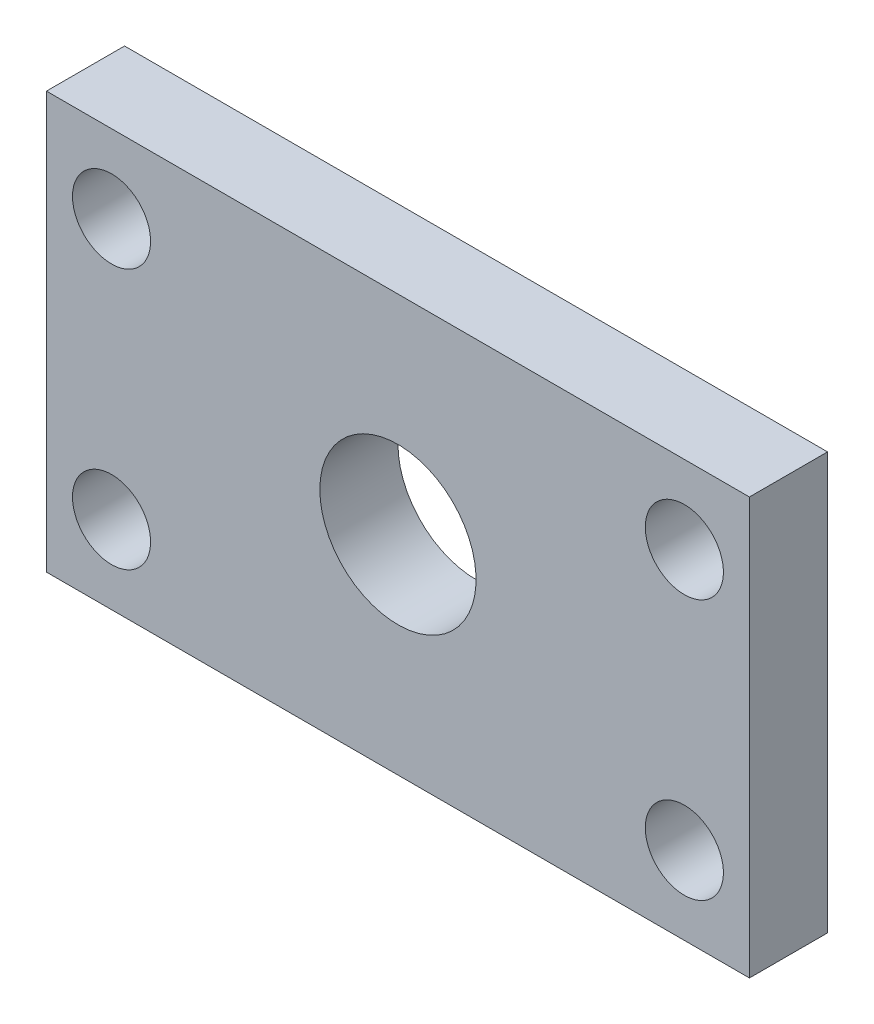
ISO-10303-21;
HEADER;
FILE_DESCRIPTION(('STEP AP214'),'2;1');
FILE_NAME('part.step','',(''),(''),'','','');
FILE_SCHEMA(('AUTOMOTIVE_DESIGN { 1 0 10303 214 1 1 1 1 }'));
ENDSEC;
DATA;
#1=APPLICATION_CONTEXT('core data for automotive mechanical design processes');
#2=APPLICATION_PROTOCOL_DEFINITION('international standard','automotive_design',2000,#1);
#3=PRODUCT_CONTEXT('',#1,'mechanical');
#4=PRODUCT('Part','Part','',(#3));
#5=PRODUCT_RELATED_PRODUCT_CATEGORY('part','',(#4));
#6=PRODUCT_DEFINITION_FORMATION('','',#4);
#7=PRODUCT_DEFINITION_CONTEXT('part definition',#1,'design');
#8=PRODUCT_DEFINITION('design','',#6,#7);
#9=PRODUCT_DEFINITION_SHAPE('','',#8);
#10=(LENGTH_UNIT() NAMED_UNIT(*) SI_UNIT(.MILLI.,.METRE.));
#11=(NAMED_UNIT(*) PLANE_ANGLE_UNIT() SI_UNIT($,.RADIAN.));
#12=(NAMED_UNIT(*) SI_UNIT($,.STERADIAN.) SOLID_ANGLE_UNIT());
#13=UNCERTAINTY_MEASURE_WITH_UNIT(LENGTH_MEASURE(1.E-05),#10,'distance_accuracy_value','');
#14=(GEOMETRIC_REPRESENTATION_CONTEXT(3) GLOBAL_UNCERTAINTY_ASSIGNED_CONTEXT((#13)) GLOBAL_UNIT_ASSIGNED_CONTEXT((#10,
#11,#12)) REPRESENTATION_CONTEXT('',''));
#15=CARTESIAN_POINT('',(0.,0.,0.));
#16=DIRECTION('',(0.,0.,1.));
#17=DIRECTION('',(1.,0.,0.));
#18=AXIS2_PLACEMENT_3D('',#15,#16,#17);
#19=CARTESIAN_POINT('',(0.,0.,0.));
#20=DIRECTION('',(0.,0.,-1.));
#21=DIRECTION('',(-1.,0.,0.));
#22=AXIS2_PLACEMENT_3D('',#19,#20,#21);
#23=PLANE('',#22);
#24=CARTESIAN_POINT('',(-11.,-5.,0.));
#25=DIRECTION('',(0.,0.,-1.));
#26=DIRECTION('',(-1.,0.,0.));
#27=AXIS2_PLACEMENT_3D('',#24,#25,#26);
#28=CIRCLE('',#27,1.5);
#29=CARTESIAN_POINT('',(-12.5,-5.,0.));
#30=VERTEX_POINT('',#29);
#31=EDGE_CURVE('E91',#30,#30,#28,.F.);
#32=ORIENTED_EDGE('',*,*,#31,.T.);
#33=EDGE_LOOP('',(#32));
#34=FACE_BOUND('',#33,.T.);
#35=CARTESIAN_POINT('',(11.,5.,0.));
#36=DIRECTION('',(0.,0.,-1.));
#37=DIRECTION('',(-1.,0.,0.));
#38=AXIS2_PLACEMENT_3D('',#35,#36,#37);
#39=CIRCLE('',#38,1.5);
#40=CARTESIAN_POINT('',(9.50000000000001,5.,0.));
#41=VERTEX_POINT('',#40);
#42=EDGE_CURVE('E97',#41,#41,#39,.F.);
#43=ORIENTED_EDGE('',*,*,#42,.T.);
#44=EDGE_LOOP('',(#43));
#45=FACE_BOUND('',#44,.T.);
#46=CARTESIAN_POINT('',(0.,0.,0.));
#47=DIRECTION('',(0.,0.,-1.));
#48=DIRECTION('',(-1.,0.,0.));
#49=AXIS2_PLACEMENT_3D('',#46,#47,#48);
#50=CIRCLE('',#49,3.);
#51=CARTESIAN_POINT('',(-3.,0.,0.));
#52=VERTEX_POINT('',#51);
#53=EDGE_CURVE('E18',#52,#52,#50,.F.);
#54=ORIENTED_EDGE('',*,*,#53,.T.);
#55=EDGE_LOOP('',(#54));
#56=FACE_BOUND('',#55,.T.);
#57=DIRECTION('',(0.,1.,0.));
#58=VECTOR('',#57,1.);
#59=CARTESIAN_POINT('',(-13.5,-8.,0.));
#60=LINE('',#59,#58);
#61=CARTESIAN_POINT('',(-13.5,-8.,0.));
#62=VERTEX_POINT('',#61);
#63=CARTESIAN_POINT('',(-13.5,8.,0.));
#64=VERTEX_POINT('',#63);
#65=EDGE_CURVE('E54',#62,#64,#60,.T.);
#66=ORIENTED_EDGE('',*,*,#65,.T.);
#67=DIRECTION('',(1.,0.,0.));
#68=VECTOR('',#67,1.);
#69=CARTESIAN_POINT('',(-13.5,8.,0.));
#70=LINE('',#69,#68);
#71=CARTESIAN_POINT('',(13.5,8.,0.));
#72=VERTEX_POINT('',#71);
#73=EDGE_CURVE('E112',#64,#72,#70,.T.);
#74=ORIENTED_EDGE('',*,*,#73,.T.);
#75=DIRECTION('',(0.,1.,0.));
#76=VECTOR('',#75,1.);
#77=CARTESIAN_POINT('',(13.5,-8.,0.));
#78=LINE('',#77,#76);
#79=CARTESIAN_POINT('',(13.5,-8.,0.));
#80=VERTEX_POINT('',#79);
#81=EDGE_CURVE('E59',#72,#80,#78,.F.);
#82=ORIENTED_EDGE('',*,*,#81,.T.);
#83=DIRECTION('',(1.,0.,0.));
#84=VECTOR('',#83,1.);
#85=CARTESIAN_POINT('',(-13.5,-8.,0.));
#86=LINE('',#85,#84);
#87=EDGE_CURVE('E57',#80,#62,#86,.F.);
#88=ORIENTED_EDGE('',*,*,#87,.T.);
#89=EDGE_LOOP('',(#66,#74,#82,#88));
#90=FACE_BOUND('',#89,.T.);
#91=CARTESIAN_POINT('',(-11.,5.,0.));
#92=DIRECTION('',(0.,0.,-1.));
#93=DIRECTION('',(-1.,0.,0.));
#94=AXIS2_PLACEMENT_3D('',#91,#92,#93);
#95=CIRCLE('',#94,1.5);
#96=CARTESIAN_POINT('',(-12.5,5.,0.));
#97=VERTEX_POINT('',#96);
#98=EDGE_CURVE('E99',#97,#97,#95,.F.);
#99=ORIENTED_EDGE('',*,*,#98,.T.);
#100=EDGE_LOOP('',(#99));
#101=FACE_BOUND('',#100,.T.);
#102=CARTESIAN_POINT('',(11.,-5.,0.));
#103=DIRECTION('',(0.,0.,-1.));
#104=DIRECTION('',(-1.,0.,0.));
#105=AXIS2_PLACEMENT_3D('',#102,#103,#104);
#106=CIRCLE('',#105,1.5);
#107=CARTESIAN_POINT('',(9.50000000000001,-5.,0.));
#108=VERTEX_POINT('',#107);
#109=EDGE_CURVE('E94',#108,#108,#106,.F.);
#110=ORIENTED_EDGE('',*,*,#109,.T.);
#111=EDGE_LOOP('',(#110));
#112=FACE_BOUND('',#111,.T.);
#113=ADVANCED_FACE('F15',(#34,#45,#56,#90,#101,#112),#23,.T.);
#114=CARTESIAN_POINT('',(-13.5,-8.,3.));
#115=DIRECTION('',(0.,1.,0.));
#116=DIRECTION('',(0.,0.,1.));
#117=AXIS2_PLACEMENT_3D('',#114,#115,#116);
#118=PLANE('',#117);
#119=DIRECTION('',(0.,0.,1.));
#120=VECTOR('',#119,1.);
#121=CARTESIAN_POINT('',(13.5,-8.,3.));
#122=LINE('',#121,#120);
#123=CARTESIAN_POINT('',(13.5,-8.,3.));
#124=VERTEX_POINT('',#123);
#125=EDGE_CURVE('E106',#80,#124,#122,.T.);
#126=ORIENTED_EDGE('',*,*,#125,.T.);
#127=DIRECTION('',(-1.,0.,0.));
#128=VECTOR('',#127,1.);
#129=CARTESIAN_POINT('',(0.,-8.,3.));
#130=LINE('',#129,#128);
#131=CARTESIAN_POINT('',(-13.5,-8.,3.));
#132=VERTEX_POINT('',#131);
#133=EDGE_CURVE('E75',#124,#132,#130,.T.);
#134=ORIENTED_EDGE('',*,*,#133,.T.);
#135=DIRECTION('',(0.,0.,-1.));
#136=VECTOR('',#135,1.);
#137=CARTESIAN_POINT('',(-13.5,-8.,3.));
#138=LINE('',#137,#136);
#139=EDGE_CURVE('E64',#132,#62,#138,.T.);
#140=ORIENTED_EDGE('',*,*,#139,.T.);
#141=ORIENTED_EDGE('',*,*,#87,.F.);
#142=EDGE_LOOP('',(#126,#134,#140,#141));
#143=FACE_BOUND('',#142,.T.);
#144=ADVANCED_FACE('F74',(#143),#118,.F.);
#145=CARTESIAN_POINT('',(-13.5,-8.,3.));
#146=DIRECTION('',(1.,0.,0.));
#147=DIRECTION('',(0.,0.,-1.));
#148=AXIS2_PLACEMENT_3D('',#145,#146,#147);
#149=PLANE('',#148);
#150=ORIENTED_EDGE('',*,*,#139,.F.);
#151=DIRECTION('',(0.,1.,0.));
#152=VECTOR('',#151,1.);
#153=CARTESIAN_POINT('',(-13.5,0.,3.));
#154=LINE('',#153,#152);
#155=CARTESIAN_POINT('',(-13.5,8.,3.));
#156=VERTEX_POINT('',#155);
#157=EDGE_CURVE('E120',#132,#156,#154,.T.);
#158=ORIENTED_EDGE('',*,*,#157,.T.);
#159=DIRECTION('',(0.,0.,-1.));
#160=VECTOR('',#159,1.);
#161=CARTESIAN_POINT('',(-13.5,8.,3.));
#162=LINE('',#161,#160);
#163=EDGE_CURVE('E71',#156,#64,#162,.T.);
#164=ORIENTED_EDGE('',*,*,#163,.T.);
#165=ORIENTED_EDGE('',*,*,#65,.F.);
#166=EDGE_LOOP('',(#150,#158,#164,#165));
#167=FACE_BOUND('',#166,.T.);
#168=ADVANCED_FACE('F68',(#167),#149,.F.);
#169=CARTESIAN_POINT('',(-13.5,8.,3.));
#170=DIRECTION('',(0.,-1.,0.));
#171=DIRECTION('',(0.,0.,-1.));
#172=AXIS2_PLACEMENT_3D('',#169,#170,#171);
#173=PLANE('',#172);
#174=ORIENTED_EDGE('',*,*,#163,.F.);
#175=DIRECTION('',(-1.,0.,0.));
#176=VECTOR('',#175,1.);
#177=CARTESIAN_POINT('',(0.,8.,3.));
#178=LINE('',#177,#176);
#179=CARTESIAN_POINT('',(13.5,8.,3.));
#180=VERTEX_POINT('',#179);
#181=EDGE_CURVE('E118',#156,#180,#178,.F.);
#182=ORIENTED_EDGE('',*,*,#181,.T.);
#183=DIRECTION('',(0.,0.,1.));
#184=VECTOR('',#183,1.);
#185=CARTESIAN_POINT('',(13.5,8.,3.));
#186=LINE('',#185,#184);
#187=EDGE_CURVE('E33',#180,#72,#186,.F.);
#188=ORIENTED_EDGE('',*,*,#187,.T.);
#189=ORIENTED_EDGE('',*,*,#73,.F.);
#190=EDGE_LOOP('',(#174,#182,#188,#189));
#191=FACE_BOUND('',#190,.T.);
#192=ADVANCED_FACE('F116',(#191),#173,.F.);
#193=CARTESIAN_POINT('',(13.5,-8.,3.));
#194=DIRECTION('',(-1.,0.,0.));
#195=DIRECTION('',(0.,0.,1.));
#196=AXIS2_PLACEMENT_3D('',#193,#194,#195);
#197=PLANE('',#196);
#198=ORIENTED_EDGE('',*,*,#187,.F.);
#199=DIRECTION('',(0.,1.,0.));
#200=VECTOR('',#199,1.);
#201=CARTESIAN_POINT('',(13.5,0.,3.));
#202=LINE('',#201,#200);
#203=EDGE_CURVE('E90',#180,#124,#202,.F.);
#204=ORIENTED_EDGE('',*,*,#203,.T.);
#205=ORIENTED_EDGE('',*,*,#125,.F.);
#206=ORIENTED_EDGE('',*,*,#81,.F.);
#207=EDGE_LOOP('',(#198,#204,#205,#206));
#208=FACE_BOUND('',#207,.T.);
#209=ADVANCED_FACE('F114',(#208),#197,.F.);
#210=CARTESIAN_POINT('',(0.,0.,3.));
#211=DIRECTION('',(0.,0.,-1.));
#212=DIRECTION('',(-1.,0.,0.));
#213=AXIS2_PLACEMENT_3D('',#210,#211,#212);
#214=CYLINDRICAL_SURFACE('',#213,3.);
#215=ORIENTED_EDGE('',*,*,#53,.F.);
#216=EDGE_LOOP('',(#215));
#217=FACE_BOUND('',#216,.T.);
#218=CARTESIAN_POINT('',(0.,0.,3.));
#219=DIRECTION('',(0.,0.,-1.));
#220=DIRECTION('',(-1.,0.,0.));
#221=AXIS2_PLACEMENT_3D('',#218,#219,#220);
#222=CIRCLE('',#221,3.);
#223=CARTESIAN_POINT('',(-3.,0.,3.));
#224=VERTEX_POINT('',#223);
#225=EDGE_CURVE('E87',#224,#224,#222,.F.);
#226=ORIENTED_EDGE('',*,*,#225,.T.);
#227=EDGE_LOOP('',(#226));
#228=FACE_BOUND('',#227,.T.);
#229=ADVANCED_FACE('F148',(#217,#228),#214,.F.);
#230=CARTESIAN_POINT('',(-11.,5.,3.));
#231=DIRECTION('',(0.,0.,-1.));
#232=DIRECTION('',(-1.,0.,0.));
#233=AXIS2_PLACEMENT_3D('',#230,#231,#232);
#234=CYLINDRICAL_SURFACE('',#233,1.5);
#235=ORIENTED_EDGE('',*,*,#98,.F.);
#236=EDGE_LOOP('',(#235));
#237=FACE_BOUND('',#236,.T.);
#238=CARTESIAN_POINT('',(-11.,5.,3.));
#239=DIRECTION('',(0.,0.,-1.));
#240=DIRECTION('',(-1.,0.,0.));
#241=AXIS2_PLACEMENT_3D('',#238,#239,#240);
#242=CIRCLE('',#241,1.5);
#243=CARTESIAN_POINT('',(-12.5,5.,3.));
#244=VERTEX_POINT('',#243);
#245=EDGE_CURVE('E84',#244,#244,#242,.F.);
#246=ORIENTED_EDGE('',*,*,#245,.T.);
#247=EDGE_LOOP('',(#246));
#248=FACE_BOUND('',#247,.T.);
#249=ADVANCED_FACE('F144',(#237,#248),#234,.F.);
#250=CARTESIAN_POINT('',(11.,5.,3.));
#251=DIRECTION('',(0.,0.,-1.));
#252=DIRECTION('',(-1.,0.,0.));
#253=AXIS2_PLACEMENT_3D('',#250,#251,#252);
#254=CYLINDRICAL_SURFACE('',#253,1.5);
#255=ORIENTED_EDGE('',*,*,#42,.F.);
#256=EDGE_LOOP('',(#255));
#257=FACE_BOUND('',#256,.T.);
#258=CARTESIAN_POINT('',(11.,5.,3.));
#259=DIRECTION('',(0.,0.,-1.));
#260=DIRECTION('',(-1.,0.,0.));
#261=AXIS2_PLACEMENT_3D('',#258,#259,#260);
#262=CIRCLE('',#261,1.5);
#263=CARTESIAN_POINT('',(9.50000000000001,5.,3.));
#264=VERTEX_POINT('',#263);
#265=EDGE_CURVE('E81',#264,#264,#262,.F.);
#266=ORIENTED_EDGE('',*,*,#265,.T.);
#267=EDGE_LOOP('',(#266));
#268=FACE_BOUND('',#267,.T.);
#269=ADVANCED_FACE('F140',(#257,#268),#254,.F.);
#270=CARTESIAN_POINT('',(11.,-5.,3.));
#271=DIRECTION('',(0.,0.,-1.));
#272=DIRECTION('',(-1.,0.,0.));
#273=AXIS2_PLACEMENT_3D('',#270,#271,#272);
#274=CYLINDRICAL_SURFACE('',#273,1.5);
#275=ORIENTED_EDGE('',*,*,#109,.F.);
#276=EDGE_LOOP('',(#275));
#277=FACE_BOUND('',#276,.T.);
#278=CARTESIAN_POINT('',(11.,-5.,3.));
#279=DIRECTION('',(0.,0.,-1.));
#280=DIRECTION('',(-1.,0.,0.));
#281=AXIS2_PLACEMENT_3D('',#278,#279,#280);
#282=CIRCLE('',#281,1.5);
#283=CARTESIAN_POINT('',(9.50000000000001,-5.,3.));
#284=VERTEX_POINT('',#283);
#285=EDGE_CURVE('E24',#284,#284,#282,.F.);
#286=ORIENTED_EDGE('',*,*,#285,.T.);
#287=EDGE_LOOP('',(#286));
#288=FACE_BOUND('',#287,.T.);
#289=ADVANCED_FACE('F132',(#277,#288),#274,.F.);
#290=CARTESIAN_POINT('',(-11.,-5.,3.));
#291=DIRECTION('',(0.,0.,-1.));
#292=DIRECTION('',(-1.,0.,0.));
#293=AXIS2_PLACEMENT_3D('',#290,#291,#292);
#294=CYLINDRICAL_SURFACE('',#293,1.5);
#295=ORIENTED_EDGE('',*,*,#31,.F.);
#296=EDGE_LOOP('',(#295));
#297=FACE_BOUND('',#296,.T.);
#298=CARTESIAN_POINT('',(-11.,-5.,3.));
#299=DIRECTION('',(0.,0.,-1.));
#300=DIRECTION('',(-1.,0.,0.));
#301=AXIS2_PLACEMENT_3D('',#298,#299,#300);
#302=CIRCLE('',#301,1.5);
#303=CARTESIAN_POINT('',(-12.5,-5.,3.));
#304=VERTEX_POINT('',#303);
#305=EDGE_CURVE('E10',#304,#304,#302,.F.);
#306=ORIENTED_EDGE('',*,*,#305,.T.);
#307=EDGE_LOOP('',(#306));
#308=FACE_BOUND('',#307,.T.);
#309=ADVANCED_FACE('F125',(#297,#308),#294,.F.);
#310=CARTESIAN_POINT('',(0.,0.,3.));
#311=DIRECTION('',(0.,0.,-1.));
#312=DIRECTION('',(-1.,0.,0.));
#313=AXIS2_PLACEMENT_3D('',#310,#311,#312);
#314=PLANE('',#313);
#315=ORIENTED_EDGE('',*,*,#305,.F.);
#316=EDGE_LOOP('',(#315));
#317=FACE_BOUND('',#316,.T.);
#318=ORIENTED_EDGE('',*,*,#285,.F.);
#319=EDGE_LOOP('',(#318));
#320=FACE_BOUND('',#319,.T.);
#321=ORIENTED_EDGE('',*,*,#265,.F.);
#322=EDGE_LOOP('',(#321));
#323=FACE_BOUND('',#322,.T.);
#324=ORIENTED_EDGE('',*,*,#245,.F.);
#325=EDGE_LOOP('',(#324));
#326=FACE_BOUND('',#325,.T.);
#327=ORIENTED_EDGE('',*,*,#225,.F.);
#328=EDGE_LOOP('',(#327));
#329=FACE_BOUND('',#328,.T.);
#330=ORIENTED_EDGE('',*,*,#181,.F.);
#331=ORIENTED_EDGE('',*,*,#157,.F.);
#332=ORIENTED_EDGE('',*,*,#133,.F.);
#333=ORIENTED_EDGE('',*,*,#203,.F.);
#334=EDGE_LOOP('',(#330,#331,#332,#333));
#335=FACE_BOUND('',#334,.T.);
#336=ADVANCED_FACE('F123',(#317,#320,#323,#326,#329,#335),#314,.F.);
#337=CLOSED_SHELL('',(#113,#144,#168,#192,#209,#229,#249,#269,#289,#309,#336));
#338=MANIFOLD_SOLID_BREP('B1',#337);
#339=ADVANCED_BREP_SHAPE_REPRESENTATION('',(#18,#338),#14);
#340=SHAPE_DEFINITION_REPRESENTATION(#9,#339);
ENDSEC;
END-ISO-10303-21;
